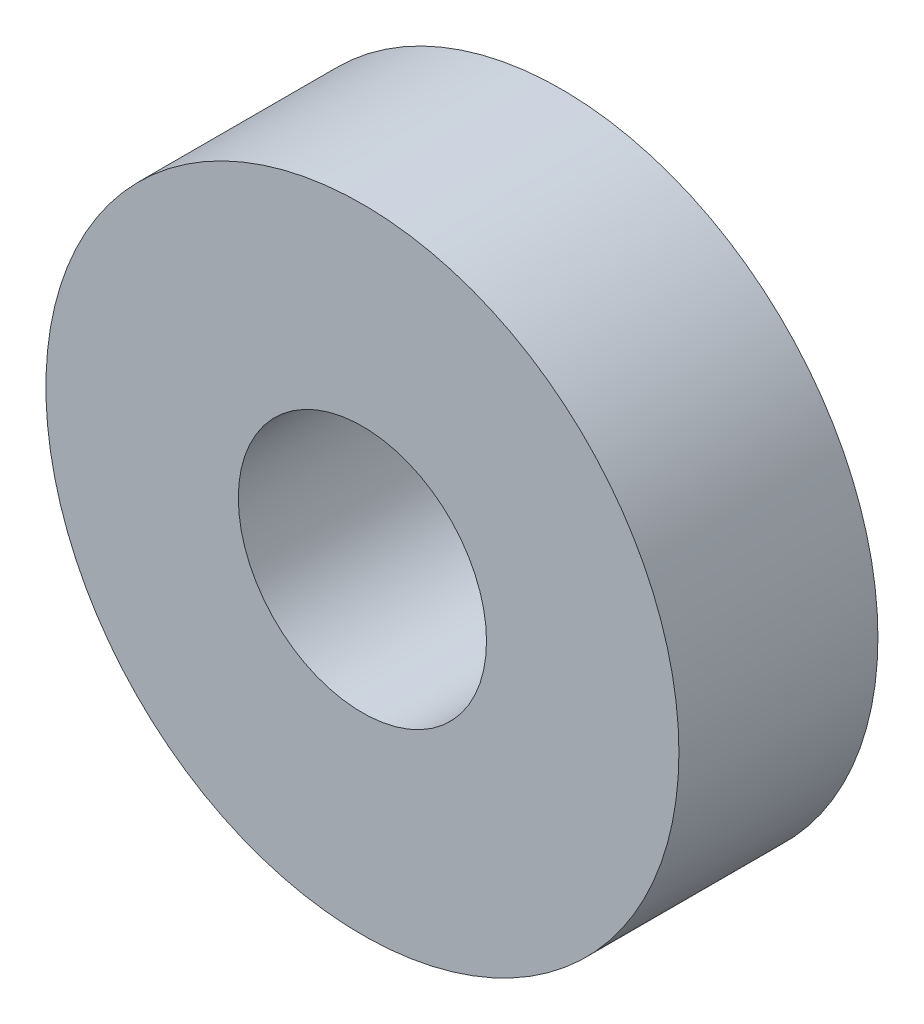
ISO-10303-21;
HEADER;
FILE_DESCRIPTION(('STEP AP214'),'2;1');
FILE_NAME('part.step','',(''),(''),'','','');
FILE_SCHEMA(('AUTOMOTIVE_DESIGN { 1 0 10303 214 1 1 1 1 }'));
ENDSEC;
DATA;
#1=APPLICATION_CONTEXT('core data for automotive mechanical design processes');
#2=APPLICATION_PROTOCOL_DEFINITION('international standard','automotive_design',2000,#1);
#3=PRODUCT_CONTEXT('',#1,'mechanical');
#4=PRODUCT('Part','Part','',(#3));
#5=PRODUCT_RELATED_PRODUCT_CATEGORY('part','',(#4));
#6=PRODUCT_DEFINITION_FORMATION('','',#4);
#7=PRODUCT_DEFINITION_CONTEXT('part definition',#1,'design');
#8=PRODUCT_DEFINITION('design','',#6,#7);
#9=PRODUCT_DEFINITION_SHAPE('','',#8);
#10=(LENGTH_UNIT() NAMED_UNIT(*) SI_UNIT(.MILLI.,.METRE.));
#11=(NAMED_UNIT(*) PLANE_ANGLE_UNIT() SI_UNIT($,.RADIAN.));
#12=(NAMED_UNIT(*) SI_UNIT($,.STERADIAN.) SOLID_ANGLE_UNIT());
#13=UNCERTAINTY_MEASURE_WITH_UNIT(LENGTH_MEASURE(1.E-05),#10,'distance_accuracy_value','');
#14=(GEOMETRIC_REPRESENTATION_CONTEXT(3) GLOBAL_UNCERTAINTY_ASSIGNED_CONTEXT((#13)) GLOBAL_UNIT_ASSIGNED_CONTEXT((#10,
#11,#12)) REPRESENTATION_CONTEXT('',''));
#15=CARTESIAN_POINT('',(0.,0.,0.));
#16=DIRECTION('',(0.,0.,1.));
#17=DIRECTION('',(1.,0.,0.));
#18=AXIS2_PLACEMENT_3D('',#15,#16,#17);
#19=CARTESIAN_POINT('',(0.,0.,6.35));
#20=DIRECTION('',(0.,0.,1.));
#21=DIRECTION('',(1.,0.,0.));
#22=AXIS2_PLACEMENT_3D('',#19,#20,#21);
#23=PLANE('',#22);
#24=CARTESIAN_POINT('',(0.,0.,6.35));
#25=DIRECTION('',(0.,0.,1.));
#26=DIRECTION('',(1.,0.,0.));
#27=AXIS2_PLACEMENT_3D('',#24,#25,#26);
#28=CIRCLE('',#27,10.1);
#29=CARTESIAN_POINT('',(10.1,0.,6.35));
#30=VERTEX_POINT('',#29);
#31=EDGE_CURVE('E10',#30,#30,#28,.T.);
#32=ORIENTED_EDGE('',*,*,#31,.T.);
#33=EDGE_LOOP('',(#32));
#34=FACE_BOUND('',#33,.T.);
#35=CARTESIAN_POINT('',(0.,0.,6.35));
#36=DIRECTION('',(0.,0.,1.));
#37=DIRECTION('',(1.,0.,0.));
#38=AXIS2_PLACEMENT_3D('',#35,#36,#37);
#39=CIRCLE('',#38,3.96);
#40=CARTESIAN_POINT('',(3.96,0.,6.35));
#41=VERTEX_POINT('',#40);
#42=EDGE_CURVE('E50',#41,#41,#39,.T.);
#43=ORIENTED_EDGE('',*,*,#42,.F.);
#44=EDGE_LOOP('',(#43));
#45=FACE_BOUND('',#44,.T.);
#46=ADVANCED_FACE('F37',(#34,#45),#23,.T.);
#47=CARTESIAN_POINT('',(0.,0.,0.));
#48=DIRECTION('',(0.,0.,1.));
#49=DIRECTION('',(1.,0.,0.));
#50=AXIS2_PLACEMENT_3D('',#47,#48,#49);
#51=PLANE('',#50);
#52=CARTESIAN_POINT('',(0.,0.,0.));
#53=DIRECTION('',(0.,0.,1.));
#54=DIRECTION('',(1.,0.,0.));
#55=AXIS2_PLACEMENT_3D('',#52,#53,#54);
#56=CIRCLE('',#55,10.1);
#57=CARTESIAN_POINT('',(10.1,0.,0.));
#58=VERTEX_POINT('',#57);
#59=EDGE_CURVE('E41',#58,#58,#56,.T.);
#60=ORIENTED_EDGE('',*,*,#59,.F.);
#61=EDGE_LOOP('',(#60));
#62=FACE_BOUND('',#61,.T.);
#63=CARTESIAN_POINT('',(0.,0.,0.));
#64=DIRECTION('',(0.,0.,1.));
#65=DIRECTION('',(1.,0.,0.));
#66=AXIS2_PLACEMENT_3D('',#63,#64,#65);
#67=CIRCLE('',#66,3.96);
#68=CARTESIAN_POINT('',(3.96,0.,0.));
#69=VERTEX_POINT('',#68);
#70=EDGE_CURVE('E52',#69,#69,#67,.T.);
#71=ORIENTED_EDGE('',*,*,#70,.T.);
#72=EDGE_LOOP('',(#71));
#73=FACE_BOUND('',#72,.T.);
#74=ADVANCED_FACE('F64',(#62,#73),#51,.F.);
#75=CARTESIAN_POINT('',(0.,0.,6.35));
#76=DIRECTION('',(0.,0.,-1.));
#77=DIRECTION('',(-1.,0.,0.));
#78=AXIS2_PLACEMENT_3D('',#75,#76,#77);
#79=CYLINDRICAL_SURFACE('',#78,10.1);
#80=ORIENTED_EDGE('',*,*,#31,.F.);
#81=EDGE_LOOP('',(#80));
#82=FACE_BOUND('',#81,.T.);
#83=ORIENTED_EDGE('',*,*,#59,.T.);
#84=EDGE_LOOP('',(#83));
#85=FACE_BOUND('',#84,.T.);
#86=ADVANCED_FACE('F39',(#82,#85),#79,.T.);
#87=CARTESIAN_POINT('',(0.,0.,6.35));
#88=DIRECTION('',(0.,0.,-1.));
#89=DIRECTION('',(-1.,0.,0.));
#90=AXIS2_PLACEMENT_3D('',#87,#88,#89);
#91=CYLINDRICAL_SURFACE('',#90,3.96);
#92=ORIENTED_EDGE('',*,*,#42,.T.);
#93=EDGE_LOOP('',(#92));
#94=FACE_BOUND('',#93,.T.);
#95=ORIENTED_EDGE('',*,*,#70,.F.);
#96=EDGE_LOOP('',(#95));
#97=FACE_BOUND('',#96,.T.);
#98=ADVANCED_FACE('F60',(#94,#97),#91,.F.);
#99=CLOSED_SHELL('',(#46,#74,#86,#98));
#100=MANIFOLD_SOLID_BREP('B2',#99);
#101=ADVANCED_BREP_SHAPE_REPRESENTATION('',(#18,#100),#14);
#102=SHAPE_DEFINITION_REPRESENTATION(#9,#101);
ENDSEC;
END-ISO-10303-21;
